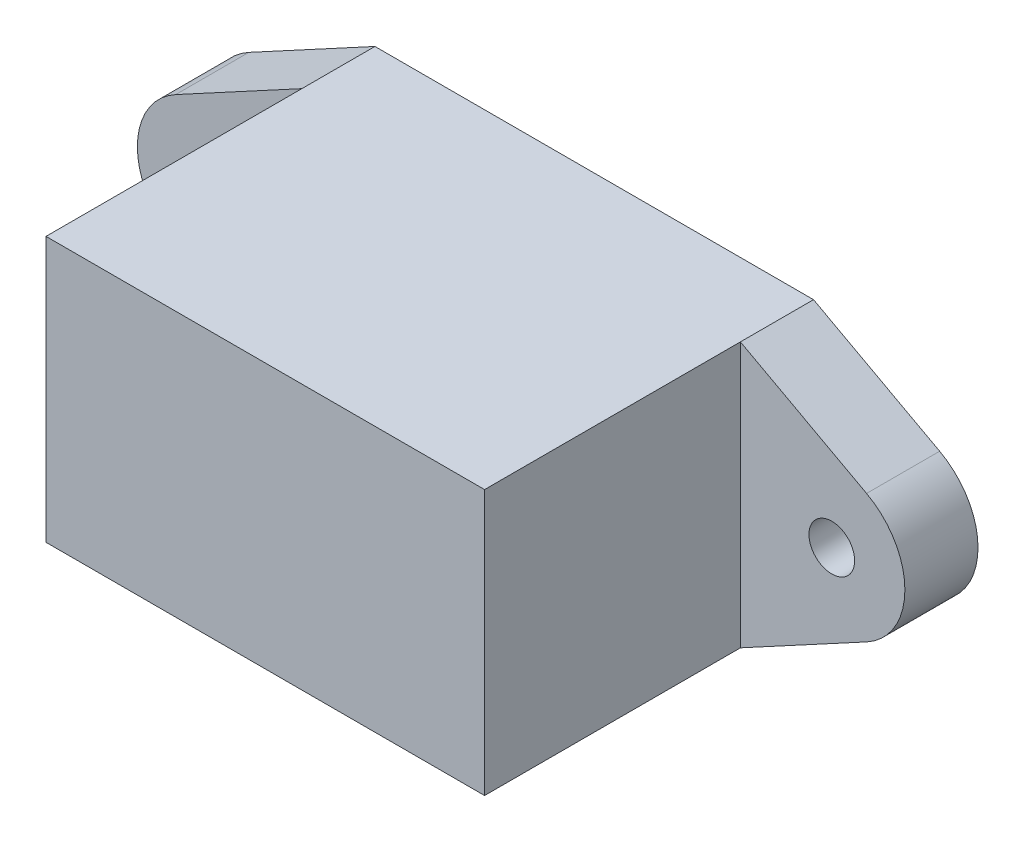
ISO-10303-21;
HEADER;
FILE_DESCRIPTION(('STEP AP214'),'2;1');
FILE_NAME('part.step','',(''),(''),'','','');
FILE_SCHEMA(('AUTOMOTIVE_DESIGN { 1 0 10303 214 1 1 1 1 }'));
ENDSEC;
DATA;
#1=APPLICATION_CONTEXT('core data for automotive mechanical design processes');
#2=APPLICATION_PROTOCOL_DEFINITION('international standard','automotive_design',2000,#1);
#3=PRODUCT_CONTEXT('',#1,'mechanical');
#4=PRODUCT('Part','Part','',(#3));
#5=PRODUCT_RELATED_PRODUCT_CATEGORY('part','',(#4));
#6=PRODUCT_DEFINITION_FORMATION('','',#4);
#7=PRODUCT_DEFINITION_CONTEXT('part definition',#1,'design');
#8=PRODUCT_DEFINITION('design','',#6,#7);
#9=PRODUCT_DEFINITION_SHAPE('','',#8);
#10=(LENGTH_UNIT() NAMED_UNIT(*) SI_UNIT(.MILLI.,.METRE.));
#11=(NAMED_UNIT(*) PLANE_ANGLE_UNIT() SI_UNIT($,.RADIAN.));
#12=(NAMED_UNIT(*) SI_UNIT($,.STERADIAN.) SOLID_ANGLE_UNIT());
#13=UNCERTAINTY_MEASURE_WITH_UNIT(LENGTH_MEASURE(1.E-05),#10,'distance_accuracy_value','');
#14=(GEOMETRIC_REPRESENTATION_CONTEXT(3) GLOBAL_UNCERTAINTY_ASSIGNED_CONTEXT((#13)) GLOBAL_UNIT_ASSIGNED_CONTEXT((#10,
#11,#12)) REPRESENTATION_CONTEXT('',''));
#15=CARTESIAN_POINT('',(0.,0.,0.));
#16=DIRECTION('',(0.,0.,1.));
#17=DIRECTION('',(1.,0.,0.));
#18=AXIS2_PLACEMENT_3D('',#15,#16,#17);
#19=CARTESIAN_POINT('',(-29.,7.25,4.));
#20=DIRECTION('',(0.,0.,-1.));
#21=DIRECTION('',(-1.,0.,0.));
#22=AXIS2_PLACEMENT_3D('',#19,#20,#21);
#23=CYLINDRICAL_SURFACE('',#22,4.);
#24=CARTESIAN_POINT('',(-29.,7.25,0.));
#25=DIRECTION('',(0.,0.,-1.));
#26=DIRECTION('',(-1.,0.,0.));
#27=AXIS2_PLACEMENT_3D('',#24,#25,#26);
#28=CIRCLE('',#27,4.);
#29=CARTESIAN_POINT('',(-30.9021968732814,3.73124353566798,0.));
#30=VERTEX_POINT('',#29);
#31=CARTESIAN_POINT('',(-30.9021968732814,10.768756464332,0.));
#32=VERTEX_POINT('',#31);
#33=EDGE_CURVE('E110',#30,#32,#28,.T.);
#34=ORIENTED_EDGE('',*,*,#33,.F.);
#35=DIRECTION('',(0.,0.,-1.));
#36=VECTOR('',#35,1.);
#37=CARTESIAN_POINT('',(-30.9021968732814,3.73124353566798,4.));
#38=LINE('',#37,#36);
#39=CARTESIAN_POINT('',(-30.9021968732814,3.73124353566798,4.));
#40=VERTEX_POINT('',#39);
#41=EDGE_CURVE('E12',#40,#30,#38,.T.);
#42=ORIENTED_EDGE('',*,*,#41,.F.);
#43=CARTESIAN_POINT('',(-29.,7.25,4.));
#44=DIRECTION('',(0.,0.,-1.));
#45=DIRECTION('',(-1.,0.,0.));
#46=AXIS2_PLACEMENT_3D('',#43,#44,#45);
#47=CIRCLE('',#46,4.);
#48=CARTESIAN_POINT('',(-30.9021968732814,10.768756464332,4.));
#49=VERTEX_POINT('',#48);
#50=EDGE_CURVE('E103',#40,#49,#47,.T.);
#51=ORIENTED_EDGE('',*,*,#50,.T.);
#52=DIRECTION('',(0.,0.,-1.));
#53=VECTOR('',#52,1.);
#54=CARTESIAN_POINT('',(-30.9021968732814,10.768756464332,4.));
#55=LINE('',#54,#53);
#56=EDGE_CURVE('E48',#49,#32,#55,.T.);
#57=ORIENTED_EDGE('',*,*,#56,.T.);
#58=EDGE_LOOP('',(#34,#42,#51,#57));
#59=FACE_BOUND('',#58,.T.);
#60=ADVANCED_FACE('F45',(#59),#23,.T.);
#61=CARTESIAN_POINT('',(-24.,0.,4.));
#62=DIRECTION('',(-0.475549218320357,-0.879689116083004,0.));
#63=DIRECTION('',(0.879689116083004,-0.475549218320357,0.));
#64=AXIS2_PLACEMENT_3D('',#61,#62,#63);
#65=PLANE('',#64);
#66=DIRECTION('',(-0.879689116083004,0.475549218320357,0.));
#67=VECTOR('',#66,1.);
#68=CARTESIAN_POINT('',(-24.,0.,0.));
#69=LINE('',#68,#67);
#70=CARTESIAN_POINT('',(-24.,0.,0.));
#71=VERTEX_POINT('',#70);
#72=EDGE_CURVE('E105',#71,#30,#69,.T.);
#73=ORIENTED_EDGE('',*,*,#72,.F.);
#74=DIRECTION('',(0.,0.,-1.));
#75=VECTOR('',#74,1.);
#76=CARTESIAN_POINT('',(-24.,0.,4.));
#77=LINE('',#76,#75);
#78=CARTESIAN_POINT('',(-24.,0.,4.));
#79=VERTEX_POINT('',#78);
#80=EDGE_CURVE('E54',#79,#71,#77,.T.);
#81=ORIENTED_EDGE('',*,*,#80,.F.);
#82=DIRECTION('',(-0.879689116083004,0.475549218320357,0.));
#83=VECTOR('',#82,1.);
#84=CARTESIAN_POINT('',(-24.,0.,4.));
#85=LINE('',#84,#83);
#86=EDGE_CURVE('E100',#79,#40,#85,.T.);
#87=ORIENTED_EDGE('',*,*,#86,.T.);
#88=ORIENTED_EDGE('',*,*,#41,.T.);
#89=EDGE_LOOP('',(#73,#81,#87,#88));
#90=FACE_BOUND('',#89,.T.);
#91=ADVANCED_FACE('F121',(#90),#65,.T.);
#92=CARTESIAN_POINT('',(-24.,14.5,4.));
#93=DIRECTION('',(1.,0.,0.));
#94=DIRECTION('',(0.,0.,-1.));
#95=AXIS2_PLACEMENT_3D('',#92,#93,#94);
#96=PLANE('',#95);
#97=DIRECTION('',(0.,-1.,0.));
#98=VECTOR('',#97,1.);
#99=CARTESIAN_POINT('',(-24.,14.5,0.));
#100=LINE('',#99,#98);
#101=CARTESIAN_POINT('',(-24.,14.5,0.));
#102=VERTEX_POINT('',#101);
#103=EDGE_CURVE('E95',#102,#71,#100,.T.);
#104=ORIENTED_EDGE('',*,*,#103,.F.);
#105=DIRECTION('',(0.,0.,-1.));
#106=VECTOR('',#105,1.);
#107=CARTESIAN_POINT('',(-24.,14.5,4.));
#108=LINE('',#107,#106);
#109=CARTESIAN_POINT('',(-24.,14.5,4.));
#110=VERTEX_POINT('',#109);
#111=EDGE_CURVE('E90',#110,#102,#108,.T.);
#112=ORIENTED_EDGE('',*,*,#111,.F.);
#113=DIRECTION('',(0.,-1.,0.));
#114=VECTOR('',#113,1.);
#115=CARTESIAN_POINT('',(-24.,14.5,4.));
#116=LINE('',#115,#114);
#117=EDGE_CURVE('E93',#110,#79,#116,.T.);
#118=ORIENTED_EDGE('',*,*,#117,.T.);
#119=ORIENTED_EDGE('',*,*,#80,.T.);
#120=EDGE_LOOP('',(#104,#112,#118,#119));
#121=FACE_BOUND('',#120,.T.);
#122=ADVANCED_FACE('F92',(#121),#96,.T.);
#123=CARTESIAN_POINT('',(-24.,14.5,4.));
#124=DIRECTION('',(-0.475549218320357,0.879689116083005,0.));
#125=DIRECTION('',(-0.879689116083005,-0.475549218320357,0.));
#126=AXIS2_PLACEMENT_3D('',#123,#124,#125);
#127=PLANE('',#126);
#128=DIRECTION('',(0.879689116083005,0.475549218320357,0.));
#129=VECTOR('',#128,1.);
#130=CARTESIAN_POINT('',(-24.,14.5,0.));
#131=LINE('',#130,#129);
#132=EDGE_CURVE('E113',#32,#102,#131,.T.);
#133=ORIENTED_EDGE('',*,*,#132,.F.);
#134=ORIENTED_EDGE('',*,*,#56,.F.);
#135=DIRECTION('',(0.879689116083005,0.475549218320357,0.));
#136=VECTOR('',#135,1.);
#137=CARTESIAN_POINT('',(-24.,14.5,4.));
#138=LINE('',#137,#136);
#139=EDGE_CURVE('E99',#49,#110,#138,.T.);
#140=ORIENTED_EDGE('',*,*,#139,.T.);
#141=ORIENTED_EDGE('',*,*,#111,.T.);
#142=EDGE_LOOP('',(#133,#134,#140,#141));
#143=FACE_BOUND('',#142,.T.);
#144=ADVANCED_FACE('F102',(#143),#127,.T.);
#145=CARTESIAN_POINT('',(-29.,7.25,4.));
#146=DIRECTION('',(0.,0.,-1.));
#147=DIRECTION('',(-1.,0.,0.));
#148=AXIS2_PLACEMENT_3D('',#145,#146,#147);
#149=PLANE('',#148);
#150=CARTESIAN_POINT('',(-29.,7.25,4.));
#151=DIRECTION('',(0.,0.,-1.));
#152=DIRECTION('',(-1.,0.,0.));
#153=AXIS2_PLACEMENT_3D('',#150,#151,#152);
#154=CIRCLE('',#153,1.25);
#155=CARTESIAN_POINT('',(-30.25,7.25,4.));
#156=VERTEX_POINT('',#155);
#157=EDGE_CURVE('E114',#156,#156,#154,.T.);
#158=ORIENTED_EDGE('',*,*,#157,.T.);
#159=EDGE_LOOP('',(#158));
#160=FACE_BOUND('',#159,.T.);
#161=ORIENTED_EDGE('',*,*,#50,.F.);
#162=ORIENTED_EDGE('',*,*,#86,.F.);
#163=ORIENTED_EDGE('',*,*,#117,.F.);
#164=ORIENTED_EDGE('',*,*,#139,.F.);
#165=EDGE_LOOP('',(#161,#162,#163,#164));
#166=FACE_BOUND('',#165,.T.);
#167=ADVANCED_FACE('F98',(#160,#166),#149,.F.);
#168=CARTESIAN_POINT('',(-29.,7.25,0.));
#169=DIRECTION('',(0.,0.,-1.));
#170=DIRECTION('',(-1.,0.,0.));
#171=AXIS2_PLACEMENT_3D('',#168,#169,#170);
#172=PLANE('',#171);
#173=CARTESIAN_POINT('',(-29.,7.25,0.));
#174=DIRECTION('',(0.,0.,-1.));
#175=DIRECTION('',(-1.,0.,0.));
#176=AXIS2_PLACEMENT_3D('',#173,#174,#175);
#177=CIRCLE('',#176,1.25);
#178=CARTESIAN_POINT('',(-30.25,7.25,0.));
#179=VERTEX_POINT('',#178);
#180=EDGE_CURVE('E151',#179,#179,#177,.T.);
#181=ORIENTED_EDGE('',*,*,#180,.F.);
#182=EDGE_LOOP('',(#181));
#183=FACE_BOUND('',#182,.T.);
#184=ORIENTED_EDGE('',*,*,#33,.T.);
#185=ORIENTED_EDGE('',*,*,#132,.T.);
#186=ORIENTED_EDGE('',*,*,#103,.T.);
#187=ORIENTED_EDGE('',*,*,#72,.T.);
#188=EDGE_LOOP('',(#184,#185,#186,#187));
#189=FACE_BOUND('',#188,.T.);
#190=ADVANCED_FACE('F120',(#183,#189),#172,.T.);
#191=CARTESIAN_POINT('',(-29.,7.25,4.));
#192=DIRECTION('',(0.,0.,-1.));
#193=DIRECTION('',(-1.,0.,0.));
#194=AXIS2_PLACEMENT_3D('',#191,#192,#193);
#195=CYLINDRICAL_SURFACE('',#194,1.25);
#196=ORIENTED_EDGE('',*,*,#157,.F.);
#197=EDGE_LOOP('',(#196));
#198=FACE_BOUND('',#197,.T.);
#199=ORIENTED_EDGE('',*,*,#180,.T.);
#200=EDGE_LOOP('',(#199));
#201=FACE_BOUND('',#200,.T.);
#202=ADVANCED_FACE('F139',(#198,#201),#195,.F.);
#203=CLOSED_SHELL('',(#60,#91,#122,#144,#167,#190,#202));
#204=MANIFOLD_SOLID_BREP('B2',#203);
#205=CARTESIAN_POINT('',(5.,7.25,4.));
#206=DIRECTION('',(0.,0.,-1.));
#207=DIRECTION('',(-1.,0.,0.));
#208=AXIS2_PLACEMENT_3D('',#205,#206,#207);
#209=CYLINDRICAL_SURFACE('',#208,4.);
#210=CARTESIAN_POINT('',(5.,7.25,0.));
#211=DIRECTION('',(0.,0.,-1.));
#212=DIRECTION('',(1.,0.,0.));
#213=AXIS2_PLACEMENT_3D('',#210,#211,#212);
#214=CIRCLE('',#213,4.);
#215=CARTESIAN_POINT('',(6.90219687328143,10.768756464332,0.));
#216=VERTEX_POINT('',#215);
#217=CARTESIAN_POINT('',(6.90219687328143,3.73124353566798,0.));
#218=VERTEX_POINT('',#217);
#219=EDGE_CURVE('E263',#216,#218,#214,.T.);
#220=ORIENTED_EDGE('',*,*,#219,.F.);
#221=DIRECTION('',(0.,0.,-1.));
#222=VECTOR('',#221,1.);
#223=CARTESIAN_POINT('',(6.90219687328143,10.768756464332,4.));
#224=LINE('',#223,#222);
#225=CARTESIAN_POINT('',(6.90219687328143,10.768756464332,4.));
#226=VERTEX_POINT('',#225);
#227=EDGE_CURVE('E43',#226,#216,#224,.T.);
#228=ORIENTED_EDGE('',*,*,#227,.F.);
#229=CARTESIAN_POINT('',(5.,7.25,4.));
#230=DIRECTION('',(0.,0.,-1.));
#231=DIRECTION('',(1.,0.,0.));
#232=AXIS2_PLACEMENT_3D('',#229,#230,#231);
#233=CIRCLE('',#232,4.);
#234=CARTESIAN_POINT('',(6.90219687328143,3.73124353566798,4.));
#235=VERTEX_POINT('',#234);
#236=EDGE_CURVE('E256',#226,#235,#233,.T.);
#237=ORIENTED_EDGE('',*,*,#236,.T.);
#238=DIRECTION('',(0.,0.,-1.));
#239=VECTOR('',#238,1.);
#240=CARTESIAN_POINT('',(6.90219687328143,3.73124353566798,4.));
#241=LINE('',#240,#239);
#242=EDGE_CURVE('E201',#235,#218,#241,.T.);
#243=ORIENTED_EDGE('',*,*,#242,.T.);
#244=EDGE_LOOP('',(#220,#228,#237,#243));
#245=FACE_BOUND('',#244,.T.);
#246=ADVANCED_FACE('F198',(#245),#209,.T.);
#247=CARTESIAN_POINT('',(0.,14.5,4.));
#248=DIRECTION('',(0.475549218320357,0.879689116083005,0.));
#249=DIRECTION('',(-0.879689116083005,0.475549218320357,0.));
#250=AXIS2_PLACEMENT_3D('',#247,#248,#249);
#251=PLANE('',#250);
#252=DIRECTION('',(0.879689116083005,-0.475549218320357,0.));
#253=VECTOR('',#252,1.);
#254=CARTESIAN_POINT('',(0.,14.5,0.));
#255=LINE('',#254,#253);
#256=CARTESIAN_POINT('',(0.,14.5,0.));
#257=VERTEX_POINT('',#256);
#258=EDGE_CURVE('E258',#257,#216,#255,.T.);
#259=ORIENTED_EDGE('',*,*,#258,.F.);
#260=DIRECTION('',(0.,0.,-1.));
#261=VECTOR('',#260,1.);
#262=CARTESIAN_POINT('',(0.,14.5,4.));
#263=LINE('',#262,#261);
#264=CARTESIAN_POINT('',(0.,14.5,4.));
#265=VERTEX_POINT('',#264);
#266=EDGE_CURVE('E207',#265,#257,#263,.T.);
#267=ORIENTED_EDGE('',*,*,#266,.F.);
#268=DIRECTION('',(0.879689116083005,-0.475549218320357,0.));
#269=VECTOR('',#268,1.);
#270=CARTESIAN_POINT('',(0.,14.5,4.));
#271=LINE('',#270,#269);
#272=EDGE_CURVE('E253',#265,#226,#271,.T.);
#273=ORIENTED_EDGE('',*,*,#272,.T.);
#274=ORIENTED_EDGE('',*,*,#227,.T.);
#275=EDGE_LOOP('',(#259,#267,#273,#274));
#276=FACE_BOUND('',#275,.T.);
#277=ADVANCED_FACE('F274',(#276),#251,.T.);
#278=CARTESIAN_POINT('',(0.,14.5,4.));
#279=DIRECTION('',(-1.,0.,0.));
#280=DIRECTION('',(0.,0.,1.));
#281=AXIS2_PLACEMENT_3D('',#278,#279,#280);
#282=PLANE('',#281);
#283=DIRECTION('',(0.,1.,0.));
#284=VECTOR('',#283,1.);
#285=CARTESIAN_POINT('',(0.,14.5,0.));
#286=LINE('',#285,#284);
#287=CARTESIAN_POINT('',(0.,0.,0.));
#288=VERTEX_POINT('',#287);
#289=EDGE_CURVE('E248',#288,#257,#286,.T.);
#290=ORIENTED_EDGE('',*,*,#289,.F.);
#291=DIRECTION('',(0.,0.,-1.));
#292=VECTOR('',#291,1.);
#293=CARTESIAN_POINT('',(0.,0.,4.));
#294=LINE('',#293,#292);
#295=CARTESIAN_POINT('',(0.,0.,4.));
#296=VERTEX_POINT('',#295);
#297=EDGE_CURVE('E243',#296,#288,#294,.T.);
#298=ORIENTED_EDGE('',*,*,#297,.F.);
#299=DIRECTION('',(0.,1.,0.));
#300=VECTOR('',#299,1.);
#301=CARTESIAN_POINT('',(0.,14.5,4.));
#302=LINE('',#301,#300);
#303=EDGE_CURVE('E246',#296,#265,#302,.T.);
#304=ORIENTED_EDGE('',*,*,#303,.T.);
#305=ORIENTED_EDGE('',*,*,#266,.T.);
#306=EDGE_LOOP('',(#290,#298,#304,#305));
#307=FACE_BOUND('',#306,.T.);
#308=ADVANCED_FACE('F245',(#307),#282,.T.);
#309=CARTESIAN_POINT('',(0.,0.,4.));
#310=DIRECTION('',(0.475549218320357,-0.879689116083004,0.));
#311=DIRECTION('',(0.879689116083004,0.475549218320357,0.));
#312=AXIS2_PLACEMENT_3D('',#309,#310,#311);
#313=PLANE('',#312);
#314=DIRECTION('',(-0.879689116083004,-0.475549218320357,0.));
#315=VECTOR('',#314,1.);
#316=CARTESIAN_POINT('',(0.,0.,0.));
#317=LINE('',#316,#315);
#318=EDGE_CURVE('E266',#218,#288,#317,.T.);
#319=ORIENTED_EDGE('',*,*,#318,.F.);
#320=ORIENTED_EDGE('',*,*,#242,.F.);
#321=DIRECTION('',(-0.879689116083004,-0.475549218320357,0.));
#322=VECTOR('',#321,1.);
#323=CARTESIAN_POINT('',(0.,0.,4.));
#324=LINE('',#323,#322);
#325=EDGE_CURVE('E252',#235,#296,#324,.T.);
#326=ORIENTED_EDGE('',*,*,#325,.T.);
#327=ORIENTED_EDGE('',*,*,#297,.T.);
#328=EDGE_LOOP('',(#319,#320,#326,#327));
#329=FACE_BOUND('',#328,.T.);
#330=ADVANCED_FACE('F255',(#329),#313,.T.);
#331=CARTESIAN_POINT('',(5.,7.25,4.));
#332=DIRECTION('',(0.,0.,1.));
#333=DIRECTION('',(1.,0.,0.));
#334=AXIS2_PLACEMENT_3D('',#331,#332,#333);
#335=PLANE('',#334);
#336=CARTESIAN_POINT('',(5.,7.25,4.));
#337=DIRECTION('',(0.,0.,-1.));
#338=DIRECTION('',(1.,0.,0.));
#339=AXIS2_PLACEMENT_3D('',#336,#337,#338);
#340=CIRCLE('',#339,1.25);
#341=CARTESIAN_POINT('',(6.25,7.25,4.));
#342=VERTEX_POINT('',#341);
#343=EDGE_CURVE('E267',#342,#342,#340,.T.);
#344=ORIENTED_EDGE('',*,*,#343,.T.);
#345=EDGE_LOOP('',(#344));
#346=FACE_BOUND('',#345,.T.);
#347=ORIENTED_EDGE('',*,*,#236,.F.);
#348=ORIENTED_EDGE('',*,*,#272,.F.);
#349=ORIENTED_EDGE('',*,*,#303,.F.);
#350=ORIENTED_EDGE('',*,*,#325,.F.);
#351=EDGE_LOOP('',(#347,#348,#349,#350));
#352=FACE_BOUND('',#351,.T.);
#353=ADVANCED_FACE('F251',(#346,#352),#335,.T.);
#354=CARTESIAN_POINT('',(5.,7.25,0.));
#355=DIRECTION('',(0.,0.,1.));
#356=DIRECTION('',(1.,0.,0.));
#357=AXIS2_PLACEMENT_3D('',#354,#355,#356);
#358=PLANE('',#357);
#359=CARTESIAN_POINT('',(5.,7.25,0.));
#360=DIRECTION('',(0.,0.,-1.));
#361=DIRECTION('',(1.,0.,0.));
#362=AXIS2_PLACEMENT_3D('',#359,#360,#361);
#363=CIRCLE('',#362,1.25);
#364=CARTESIAN_POINT('',(6.25,7.25,0.));
#365=VERTEX_POINT('',#364);
#366=EDGE_CURVE('E304',#365,#365,#363,.T.);
#367=ORIENTED_EDGE('',*,*,#366,.F.);
#368=EDGE_LOOP('',(#367));
#369=FACE_BOUND('',#368,.T.);
#370=ORIENTED_EDGE('',*,*,#219,.T.);
#371=ORIENTED_EDGE('',*,*,#318,.T.);
#372=ORIENTED_EDGE('',*,*,#289,.T.);
#373=ORIENTED_EDGE('',*,*,#258,.T.);
#374=EDGE_LOOP('',(#370,#371,#372,#373));
#375=FACE_BOUND('',#374,.T.);
#376=ADVANCED_FACE('F273',(#369,#375),#358,.F.);
#377=CARTESIAN_POINT('',(5.,7.25,4.));
#378=DIRECTION('',(0.,0.,-1.));
#379=DIRECTION('',(-1.,0.,0.));
#380=AXIS2_PLACEMENT_3D('',#377,#378,#379);
#381=CYLINDRICAL_SURFACE('',#380,1.25);
#382=ORIENTED_EDGE('',*,*,#343,.F.);
#383=EDGE_LOOP('',(#382));
#384=FACE_BOUND('',#383,.T.);
#385=ORIENTED_EDGE('',*,*,#366,.T.);
#386=EDGE_LOOP('',(#385));
#387=FACE_BOUND('',#386,.T.);
#388=ADVANCED_FACE('F292',(#384,#387),#381,.F.);
#389=CLOSED_SHELL('',(#246,#277,#308,#330,#353,#376,#388));
#390=MANIFOLD_SOLID_BREP('B6',#389);
#391=CARTESIAN_POINT('',(0.,14.5,18.));
#392=DIRECTION('',(-1.,0.,0.));
#393=DIRECTION('',(0.,0.,1.));
#394=AXIS2_PLACEMENT_3D('',#391,#392,#393);
#395=PLANE('',#394);
#396=DIRECTION('',(0.,1.,0.));
#397=VECTOR('',#396,1.);
#398=CARTESIAN_POINT('',(0.,14.5,0.));
#399=LINE('',#398,#397);
#400=CARTESIAN_POINT('',(0.,0.,0.));
#401=VERTEX_POINT('',#400);
#402=CARTESIAN_POINT('',(0.,14.5,0.));
#403=VERTEX_POINT('',#402);
#404=EDGE_CURVE('E450',#401,#403,#399,.T.);
#405=ORIENTED_EDGE('',*,*,#404,.T.);
#406=DIRECTION('',(0.,0.,-1.));
#407=VECTOR('',#406,1.);
#408=CARTESIAN_POINT('',(0.,14.5,18.));
#409=LINE('',#408,#407);
#410=CARTESIAN_POINT('',(0.,14.5,18.));
#411=VERTEX_POINT('',#410);
#412=EDGE_CURVE('E196',#411,#403,#409,.T.);
#413=ORIENTED_EDGE('',*,*,#412,.F.);
#414=DIRECTION('',(0.,1.,0.));
#415=VECTOR('',#414,1.);
#416=CARTESIAN_POINT('',(0.,14.5,18.));
#417=LINE('',#416,#415);
#418=CARTESIAN_POINT('',(0.,0.,18.));
#419=VERTEX_POINT('',#418);
#420=EDGE_CURVE('E454',#419,#411,#417,.T.);
#421=ORIENTED_EDGE('',*,*,#420,.F.);
#422=DIRECTION('',(0.,0.,-1.));
#423=VECTOR('',#422,1.);
#424=CARTESIAN_POINT('',(0.,0.,18.));
#425=LINE('',#424,#423);
#426=EDGE_CURVE('E460',#419,#401,#425,.T.);
#427=ORIENTED_EDGE('',*,*,#426,.T.);
#428=EDGE_LOOP('',(#405,#413,#421,#427));
#429=FACE_BOUND('',#428,.T.);
#430=ADVANCED_FACE('F342',(#429),#395,.F.);
#431=CARTESIAN_POINT('',(-24.,14.5,18.));
#432=DIRECTION('',(0.,-1.,0.));
#433=DIRECTION('',(0.,0.,-1.));
#434=AXIS2_PLACEMENT_3D('',#431,#432,#433);
#435=PLANE('',#434);
#436=DIRECTION('',(-1.,0.,0.));
#437=VECTOR('',#436,1.);
#438=CARTESIAN_POINT('',(-24.,14.5,0.));
#439=LINE('',#438,#437);
#440=CARTESIAN_POINT('',(-24.,14.5,0.));
#441=VERTEX_POINT('',#440);
#442=EDGE_CURVE('E463',#403,#441,#439,.T.);
#443=ORIENTED_EDGE('',*,*,#442,.T.);
#444=DIRECTION('',(0.,0.,-1.));
#445=VECTOR('',#444,1.);
#446=CARTESIAN_POINT('',(-24.,14.5,18.));
#447=LINE('',#446,#445);
#448=CARTESIAN_POINT('',(-24.,14.5,18.));
#449=VERTEX_POINT('',#448);
#450=EDGE_CURVE('E349',#449,#441,#447,.T.);
#451=ORIENTED_EDGE('',*,*,#450,.F.);
#452=DIRECTION('',(-1.,0.,0.));
#453=VECTOR('',#452,1.);
#454=CARTESIAN_POINT('',(-24.,14.5,18.));
#455=LINE('',#454,#453);
#456=EDGE_CURVE('E393',#411,#449,#455,.T.);
#457=ORIENTED_EDGE('',*,*,#456,.F.);
#458=ORIENTED_EDGE('',*,*,#412,.T.);
#459=EDGE_LOOP('',(#443,#451,#457,#458));
#460=FACE_BOUND('',#459,.T.);
#461=ADVANCED_FACE('F491',(#460),#435,.F.);
#462=CARTESIAN_POINT('',(-24.,0.,18.));
#463=DIRECTION('',(1.,0.,0.));
#464=DIRECTION('',(0.,0.,-1.));
#465=AXIS2_PLACEMENT_3D('',#462,#463,#464);
#466=PLANE('',#465);
#467=DIRECTION('',(0.,-1.,0.));
#468=VECTOR('',#467,1.);
#469=CARTESIAN_POINT('',(-24.,0.,0.));
#470=LINE('',#469,#468);
#471=CARTESIAN_POINT('',(-24.,0.,0.));
#472=VERTEX_POINT('',#471);
#473=EDGE_CURVE('E465',#441,#472,#470,.T.);
#474=ORIENTED_EDGE('',*,*,#473,.T.);
#475=DIRECTION('',(0.,0.,-1.));
#476=VECTOR('',#475,1.);
#477=CARTESIAN_POINT('',(-24.,0.,18.));
#478=LINE('',#477,#476);
#479=CARTESIAN_POINT('',(-24.,0.,18.));
#480=VERTEX_POINT('',#479);
#481=EDGE_CURVE('E469',#480,#472,#478,.T.);
#482=ORIENTED_EDGE('',*,*,#481,.F.);
#483=DIRECTION('',(0.,-1.,0.));
#484=VECTOR('',#483,1.);
#485=CARTESIAN_POINT('',(-24.,0.,18.));
#486=LINE('',#485,#484);
#487=EDGE_CURVE('E457',#449,#480,#486,.T.);
#488=ORIENTED_EDGE('',*,*,#487,.F.);
#489=ORIENTED_EDGE('',*,*,#450,.T.);
#490=EDGE_LOOP('',(#474,#482,#488,#489));
#491=FACE_BOUND('',#490,.T.);
#492=ADVANCED_FACE('F474',(#491),#466,.F.);
#493=CARTESIAN_POINT('',(0.,0.,18.));
#494=DIRECTION('',(0.,1.,0.));
#495=DIRECTION('',(-1.,0.,0.));
#496=AXIS2_PLACEMENT_3D('',#493,#494,#495);
#497=PLANE('',#496);
#498=DIRECTION('',(1.,0.,0.));
#499=VECTOR('',#498,1.);
#500=CARTESIAN_POINT('',(0.,0.,0.));
#501=LINE('',#500,#499);
#502=EDGE_CURVE('E386',#472,#401,#501,.T.);
#503=ORIENTED_EDGE('',*,*,#502,.T.);
#504=ORIENTED_EDGE('',*,*,#426,.F.);
#505=DIRECTION('',(1.,0.,0.));
#506=VECTOR('',#505,1.);
#507=CARTESIAN_POINT('',(0.,0.,18.));
#508=LINE('',#507,#506);
#509=EDGE_CURVE('E365',#480,#419,#508,.T.);
#510=ORIENTED_EDGE('',*,*,#509,.F.);
#511=ORIENTED_EDGE('',*,*,#481,.T.);
#512=EDGE_LOOP('',(#503,#504,#510,#511));
#513=FACE_BOUND('',#512,.T.);
#514=ADVANCED_FACE('F482',(#513),#497,.F.);
#515=CARTESIAN_POINT('',(0.,0.,18.));
#516=DIRECTION('',(0.,0.,-1.));
#517=DIRECTION('',(-1.,0.,0.));
#518=AXIS2_PLACEMENT_3D('',#515,#516,#517);
#519=PLANE('',#518);
#520=ORIENTED_EDGE('',*,*,#420,.T.);
#521=ORIENTED_EDGE('',*,*,#456,.T.);
#522=ORIENTED_EDGE('',*,*,#487,.T.);
#523=ORIENTED_EDGE('',*,*,#509,.T.);
#524=EDGE_LOOP('',(#520,#521,#522,#523));
#525=FACE_BOUND('',#524,.T.);
#526=ADVANCED_FACE('F484',(#525),#519,.F.);
#527=CARTESIAN_POINT('',(0.,0.,0.));
#528=DIRECTION('',(0.,0.,-1.));
#529=DIRECTION('',(-1.,0.,0.));
#530=AXIS2_PLACEMENT_3D('',#527,#528,#529);
#531=PLANE('',#530);
#532=DIRECTION('',(0.,-1.,0.));
#533=VECTOR('',#532,1.);
#534=CARTESIAN_POINT('',(-5.,7.25,0.));
#535=LINE('',#534,#533);
#536=CARTESIAN_POINT('',(-5.,10.75,0.));
#537=VERTEX_POINT('',#536);
#538=CARTESIAN_POINT('',(-5.,3.75,0.));
#539=VERTEX_POINT('',#538);
#540=EDGE_CURVE('E419',#537,#539,#535,.T.);
#541=ORIENTED_EDGE('',*,*,#540,.F.);
#542=DIRECTION('',(1.,0.,0.));
#543=VECTOR('',#542,1.);
#544=CARTESIAN_POINT('',(-5.,10.75,0.));
#545=LINE('',#544,#543);
#546=CARTESIAN_POINT('',(-19.,10.75,0.));
#547=VERTEX_POINT('',#546);
#548=EDGE_CURVE('E436',#547,#537,#545,.T.);
#549=ORIENTED_EDGE('',*,*,#548,.F.);
#550=DIRECTION('',(0.,1.,0.));
#551=VECTOR('',#550,1.);
#552=CARTESIAN_POINT('',(-19.,10.75,0.));
#553=LINE('',#552,#551);
#554=CARTESIAN_POINT('',(-19.,3.75,0.));
#555=VERTEX_POINT('',#554);
#556=EDGE_CURVE('E443',#555,#547,#553,.T.);
#557=ORIENTED_EDGE('',*,*,#556,.F.);
#558=DIRECTION('',(-1.,0.,0.));
#559=VECTOR('',#558,1.);
#560=CARTESIAN_POINT('',(-19.,3.75,0.));
#561=LINE('',#560,#559);
#562=EDGE_CURVE('E441',#539,#555,#561,.T.);
#563=ORIENTED_EDGE('',*,*,#562,.F.);
#564=EDGE_LOOP('',(#541,#549,#557,#563));
#565=FACE_BOUND('',#564,.T.);
#566=ORIENTED_EDGE('',*,*,#404,.F.);
#567=ORIENTED_EDGE('',*,*,#502,.F.);
#568=ORIENTED_EDGE('',*,*,#473,.F.);
#569=ORIENTED_EDGE('',*,*,#442,.F.);
#570=EDGE_LOOP('',(#566,#567,#568,#569));
#571=FACE_BOUND('',#570,.T.);
#572=ADVANCED_FACE('F478',(#565,#571),#531,.T.);
#573=CARTESIAN_POINT('',(-5.,7.25,1.5));
#574=DIRECTION('',(1.,0.,0.));
#575=DIRECTION('',(0.,0.,-1.));
#576=AXIS2_PLACEMENT_3D('',#573,#574,#575);
#577=PLANE('',#576);
#578=ORIENTED_EDGE('',*,*,#540,.T.);
#579=DIRECTION('',(0.,0.,-1.));
#580=VECTOR('',#579,1.);
#581=CARTESIAN_POINT('',(-5.,3.75,1.5));
#582=LINE('',#581,#580);
#583=CARTESIAN_POINT('',(-5.,3.75,1.5));
#584=VERTEX_POINT('',#583);
#585=EDGE_CURVE('E356',#584,#539,#582,.T.);
#586=ORIENTED_EDGE('',*,*,#585,.F.);
#587=DIRECTION('',(0.,-1.,0.));
#588=VECTOR('',#587,1.);
#589=CARTESIAN_POINT('',(-5.,3.75,1.5));
#590=LINE('',#589,#588);
#591=CARTESIAN_POINT('',(-5.,10.75,1.5));
#592=VERTEX_POINT('',#591);
#593=EDGE_CURVE('E416',#592,#584,#590,.T.);
#594=ORIENTED_EDGE('',*,*,#593,.F.);
#595=DIRECTION('',(0.,0.,-1.));
#596=VECTOR('',#595,1.);
#597=CARTESIAN_POINT('',(-5.,10.75,1.5));
#598=LINE('',#597,#596);
#599=EDGE_CURVE('E448',#592,#537,#598,.T.);
#600=ORIENTED_EDGE('',*,*,#599,.T.);
#601=EDGE_LOOP('',(#578,#586,#594,#600));
#602=FACE_BOUND('',#601,.T.);
#603=ADVANCED_FACE('F414',(#602),#577,.F.);
#604=CARTESIAN_POINT('',(-5.,10.75,1.5));
#605=DIRECTION('',(0.,1.,0.));
#606=DIRECTION('',(0.,0.,1.));
#607=AXIS2_PLACEMENT_3D('',#604,#605,#606);
#608=PLANE('',#607);
#609=ORIENTED_EDGE('',*,*,#548,.T.);
#610=ORIENTED_EDGE('',*,*,#599,.F.);
#611=DIRECTION('',(1.,0.,0.));
#612=VECTOR('',#611,1.);
#613=CARTESIAN_POINT('',(-5.,10.75,1.5));
#614=LINE('',#613,#612);
#615=CARTESIAN_POINT('',(-19.,10.75,1.5));
#616=VERTEX_POINT('',#615);
#617=EDGE_CURVE('E422',#616,#592,#614,.T.);
#618=ORIENTED_EDGE('',*,*,#617,.F.);
#619=DIRECTION('',(0.,0.,-1.));
#620=VECTOR('',#619,1.);
#621=CARTESIAN_POINT('',(-19.,10.75,1.5));
#622=LINE('',#621,#620);
#623=EDGE_CURVE('E451',#616,#547,#622,.T.);
#624=ORIENTED_EDGE('',*,*,#623,.T.);
#625=EDGE_LOOP('',(#609,#610,#618,#624));
#626=FACE_BOUND('',#625,.T.);
#627=ADVANCED_FACE('F532',(#626),#608,.F.);
#628=CARTESIAN_POINT('',(-19.,10.75,1.5));
#629=DIRECTION('',(-1.,0.,0.));
#630=DIRECTION('',(0.,0.,1.));
#631=AXIS2_PLACEMENT_3D('',#628,#629,#630);
#632=PLANE('',#631);
#633=ORIENTED_EDGE('',*,*,#556,.T.);
#634=ORIENTED_EDGE('',*,*,#623,.F.);
#635=DIRECTION('',(0.,1.,0.));
#636=VECTOR('',#635,1.);
#637=CARTESIAN_POINT('',(-19.,10.75,1.5));
#638=LINE('',#637,#636);
#639=CARTESIAN_POINT('',(-19.,3.75,1.5));
#640=VERTEX_POINT('',#639);
#641=EDGE_CURVE('E430',#640,#616,#638,.T.);
#642=ORIENTED_EDGE('',*,*,#641,.F.);
#643=DIRECTION('',(0.,0.,-1.));
#644=VECTOR('',#643,1.);
#645=CARTESIAN_POINT('',(-19.,3.75,1.5));
#646=LINE('',#645,#644);
#647=EDGE_CURVE('E421',#640,#555,#646,.T.);
#648=ORIENTED_EDGE('',*,*,#647,.T.);
#649=EDGE_LOOP('',(#633,#634,#642,#648));
#650=FACE_BOUND('',#649,.T.);
#651=ADVANCED_FACE('F541',(#650),#632,.F.);
#652=CARTESIAN_POINT('',(-19.,3.75,1.5));
#653=DIRECTION('',(0.,-1.,0.));
#654=DIRECTION('',(0.,0.,-1.));
#655=AXIS2_PLACEMENT_3D('',#652,#653,#654);
#656=PLANE('',#655);
#657=ORIENTED_EDGE('',*,*,#562,.T.);
#658=ORIENTED_EDGE('',*,*,#647,.F.);
#659=DIRECTION('',(-1.,0.,0.));
#660=VECTOR('',#659,1.);
#661=CARTESIAN_POINT('',(-19.,3.75,1.5));
#662=LINE('',#661,#660);
#663=EDGE_CURVE('E425',#584,#640,#662,.T.);
#664=ORIENTED_EDGE('',*,*,#663,.F.);
#665=ORIENTED_EDGE('',*,*,#585,.T.);
#666=EDGE_LOOP('',(#657,#658,#664,#665));
#667=FACE_BOUND('',#666,.T.);
#668=ADVANCED_FACE('F426',(#667),#656,.F.);
#669=CARTESIAN_POINT('',(0.,0.,1.5));
#670=DIRECTION('',(0.,0.,1.));
#671=DIRECTION('',(1.,0.,0.));
#672=AXIS2_PLACEMENT_3D('',#669,#670,#671);
#673=PLANE('',#672);
#674=ORIENTED_EDGE('',*,*,#593,.T.);
#675=ORIENTED_EDGE('',*,*,#663,.T.);
#676=ORIENTED_EDGE('',*,*,#641,.T.);
#677=ORIENTED_EDGE('',*,*,#617,.T.);
#678=EDGE_LOOP('',(#674,#675,#676,#677));
#679=FACE_BOUND('',#678,.T.);
#680=ADVANCED_FACE('F433',(#679),#673,.F.);
#681=CLOSED_SHELL('',(#430,#461,#492,#514,#526,#572,#603,#627,#651,#668,#680));
#682=MANIFOLD_SOLID_BREP('B37',#681);
#683=ADVANCED_BREP_SHAPE_REPRESENTATION('',(#18,#204,#390,#682),#14);
#684=SHAPE_DEFINITION_REPRESENTATION(#9,#683);
ENDSEC;
END-ISO-10303-21;
